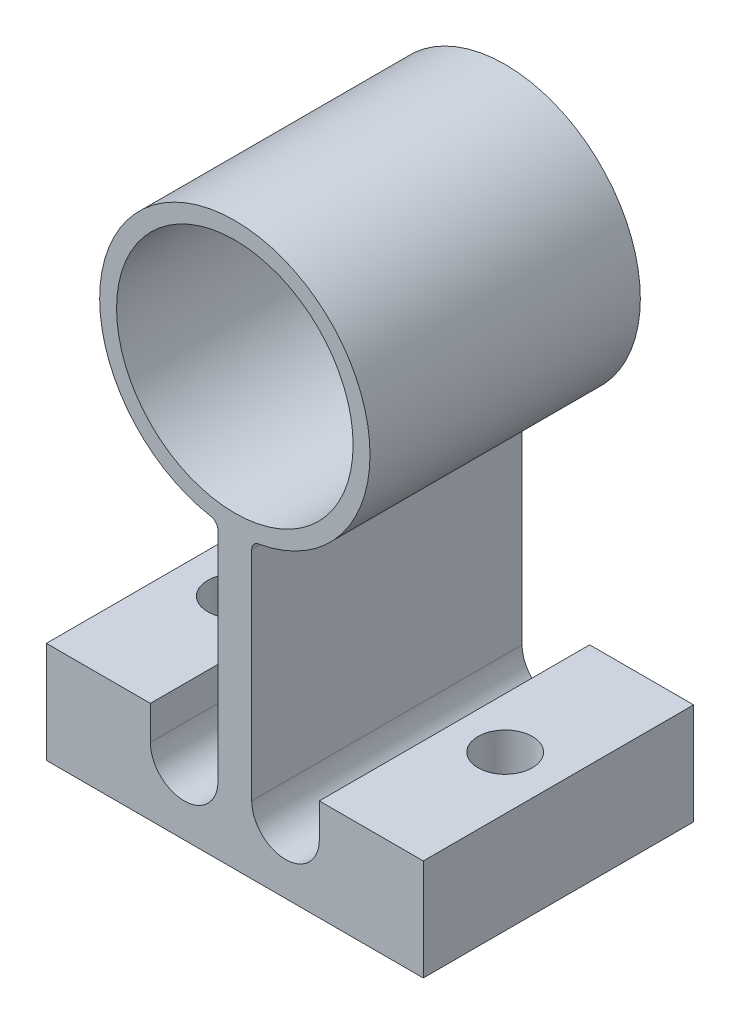
ISO-10303-21;
HEADER;
FILE_DESCRIPTION(('STEP AP214'),'2;1');
FILE_NAME('part.step','',(''),(''),'','','');
FILE_SCHEMA(('AUTOMOTIVE_DESIGN { 1 0 10303 214 1 1 1 1 }'));
ENDSEC;
DATA;
#1=APPLICATION_CONTEXT('core data for automotive mechanical design processes');
#2=APPLICATION_PROTOCOL_DEFINITION('international standard','automotive_design',2000,#1);
#3=PRODUCT_CONTEXT('',#1,'mechanical');
#4=PRODUCT('Part','Part','',(#3));
#5=PRODUCT_RELATED_PRODUCT_CATEGORY('part','',(#4));
#6=PRODUCT_DEFINITION_FORMATION('','',#4);
#7=PRODUCT_DEFINITION_CONTEXT('part definition',#1,'design');
#8=PRODUCT_DEFINITION('design','',#6,#7);
#9=PRODUCT_DEFINITION_SHAPE('','',#8);
#10=(LENGTH_UNIT() NAMED_UNIT(*) SI_UNIT(.MILLI.,.METRE.));
#11=(NAMED_UNIT(*) PLANE_ANGLE_UNIT() SI_UNIT($,.RADIAN.));
#12=(NAMED_UNIT(*) SI_UNIT($,.STERADIAN.) SOLID_ANGLE_UNIT());
#13=UNCERTAINTY_MEASURE_WITH_UNIT(LENGTH_MEASURE(1.E-05),#10,'distance_accuracy_value','');
#14=(GEOMETRIC_REPRESENTATION_CONTEXT(3) GLOBAL_UNCERTAINTY_ASSIGNED_CONTEXT((#13)) GLOBAL_UNIT_ASSIGNED_CONTEXT((#10,
#11,#12)) REPRESENTATION_CONTEXT('',''));
#15=CARTESIAN_POINT('',(0.,0.,0.));
#16=DIRECTION('',(0.,0.,1.));
#17=DIRECTION('',(1.,0.,0.));
#18=AXIS2_PLACEMENT_3D('',#15,#16,#17);
#19=CARTESIAN_POINT('',(0.,0.,-12.7));
#20=DIRECTION('',(0.,0.,-1.));
#21=DIRECTION('',(-1.,0.,0.));
#22=AXIS2_PLACEMENT_3D('',#19,#20,#21);
#23=PLANE('',#22);
#24=DIRECTION('',(0.,-1.,0.));
#25=VECTOR('',#24,1.);
#26=CARTESIAN_POINT('',(1.5875,-12.6003906189451,-12.7));
#27=LINE('',#26,#25);
#28=CARTESIAN_POINT('',(1.5875,-13.2819779212284,-12.7));
#29=VERTEX_POINT('',#28);
#30=CARTESIAN_POINT('',(1.58749999999999,-33.7337,-12.7));
#31=VERTEX_POINT('',#30);
#32=EDGE_CURVE('E301',#29,#31,#27,.T.);
#33=ORIENTED_EDGE('',*,*,#32,.T.);
#34=CARTESIAN_POINT('',(4.76249999999999,-33.7337,-12.7));
#35=DIRECTION('',(0.,0.,-1.));
#36=DIRECTION('',(1.,0.,0.));
#37=AXIS2_PLACEMENT_3D('',#34,#35,#36);
#38=CIRCLE('',#37,3.175);
#39=CARTESIAN_POINT('',(7.93749999999999,-33.7337,-12.7));
#40=VERTEX_POINT('',#39);
#41=EDGE_CURVE('E155',#40,#31,#38,.T.);
#42=ORIENTED_EDGE('',*,*,#41,.F.);
#43=DIRECTION('',(0.,-1.,0.));
#44=VECTOR('',#43,1.);
#45=CARTESIAN_POINT('',(7.93749999999999,-33.7337,-12.7));
#46=LINE('',#45,#44);
#47=CARTESIAN_POINT('',(7.9375,-30.5587,-12.7));
#48=VERTEX_POINT('',#47);
#49=EDGE_CURVE('E338',#48,#40,#46,.T.);
#50=ORIENTED_EDGE('',*,*,#49,.F.);
#51=DIRECTION('',(1.,0.,0.));
#52=VECTOR('',#51,1.);
#53=CARTESIAN_POINT('',(17.705953405,-30.5587,-12.7));
#54=LINE('',#53,#52);
#55=CARTESIAN_POINT('',(17.705953405,-30.5587,-12.7));
#56=VERTEX_POINT('',#55);
#57=EDGE_CURVE('E163',#48,#56,#54,.T.);
#58=ORIENTED_EDGE('',*,*,#57,.T.);
#59=DIRECTION('',(0.,-1.,0.));
#60=VECTOR('',#59,1.);
#61=CARTESIAN_POINT('',(17.705953405,-40.0837,-12.7));
#62=LINE('',#61,#60);
#63=CARTESIAN_POINT('',(17.705953405,-40.0837,-12.7));
#64=VERTEX_POINT('',#63);
#65=EDGE_CURVE('E306',#56,#64,#62,.T.);
#66=ORIENTED_EDGE('',*,*,#65,.T.);
#67=DIRECTION('',(-1.,0.,0.));
#68=VECTOR('',#67,1.);
#69=CARTESIAN_POINT('',(-17.705953405,-40.0837,-12.7));
#70=LINE('',#69,#68);
#71=CARTESIAN_POINT('',(-17.705953405,-40.0837,-12.7));
#72=VERTEX_POINT('',#71);
#73=EDGE_CURVE('E309',#64,#72,#70,.T.);
#74=ORIENTED_EDGE('',*,*,#73,.T.);
#75=DIRECTION('',(0.,1.,0.));
#76=VECTOR('',#75,1.);
#77=CARTESIAN_POINT('',(-17.705953405,-40.0837,-12.7));
#78=LINE('',#77,#76);
#79=CARTESIAN_POINT('',(-17.705953405,-30.5587,-12.7));
#80=VERTEX_POINT('',#79);
#81=EDGE_CURVE('E194',#72,#80,#78,.T.);
#82=ORIENTED_EDGE('',*,*,#81,.T.);
#83=DIRECTION('',(1.,0.,0.));
#84=VECTOR('',#83,1.);
#85=CARTESIAN_POINT('',(-17.705953405,-30.5587,-12.7));
#86=LINE('',#85,#84);
#87=CARTESIAN_POINT('',(-7.93750000000001,-30.5587,-12.7));
#88=VERTEX_POINT('',#87);
#89=EDGE_CURVE('E188',#80,#88,#86,.T.);
#90=ORIENTED_EDGE('',*,*,#89,.T.);
#91=DIRECTION('',(0.,1.,0.));
#92=VECTOR('',#91,1.);
#93=CARTESIAN_POINT('',(-7.9375,-33.7337,-12.7));
#94=LINE('',#93,#92);
#95=CARTESIAN_POINT('',(-7.9375,-33.7337,-12.7));
#96=VERTEX_POINT('',#95);
#97=EDGE_CURVE('E252',#96,#88,#94,.T.);
#98=ORIENTED_EDGE('',*,*,#97,.F.);
#99=CARTESIAN_POINT('',(-4.7625,-33.7337,-12.7));
#100=DIRECTION('',(0.,0.,-1.));
#101=DIRECTION('',(-1.,0.,0.));
#102=AXIS2_PLACEMENT_3D('',#99,#100,#101);
#103=CIRCLE('',#102,3.175);
#104=CARTESIAN_POINT('',(-1.5875,-33.7337,-12.7));
#105=VERTEX_POINT('',#104);
#106=EDGE_CURVE('E243',#105,#96,#103,.T.);
#107=ORIENTED_EDGE('',*,*,#106,.F.);
#108=DIRECTION('',(0.,1.,0.));
#109=VECTOR('',#108,1.);
#110=CARTESIAN_POINT('',(-1.5875,-12.6003906189451,-12.7));
#111=LINE('',#110,#109);
#112=CARTESIAN_POINT('',(-1.5875,-13.2819779212284,-12.7));
#113=VERTEX_POINT('',#112);
#114=EDGE_CURVE('E57',#105,#113,#111,.T.);
#115=ORIENTED_EDGE('',*,*,#114,.T.);
#116=CARTESIAN_POINT('',(-2.38125,-13.2819779212284,-12.7));
#117=DIRECTION('',(0.,0.,-1.));
#118=DIRECTION('',(-1.,0.,0.));
#119=AXIS2_PLACEMENT_3D('',#116,#117,#118);
#120=CIRCLE('',#119,0.79375);
#121=CARTESIAN_POINT('',(-2.24117647058823,-12.5006851023327,-12.7));
#122=VERTEX_POINT('',#121);
#123=EDGE_CURVE('E11',#113,#122,#120,.F.);
#124=ORIENTED_EDGE('',*,*,#123,.T.);
#125=CARTESIAN_POINT('',(0.,0.,-12.7));
#126=DIRECTION('',(0.,0.,-1.));
#127=DIRECTION('',(-1.,0.,0.));
#128=AXIS2_PLACEMENT_3D('',#125,#126,#127);
#129=CIRCLE('',#128,12.7);
#130=CARTESIAN_POINT('',(2.24117647058823,-12.5006851023327,-12.7));
#131=VERTEX_POINT('',#130);
#132=EDGE_CURVE('E238',#122,#131,#129,.T.);
#133=ORIENTED_EDGE('',*,*,#132,.T.);
#134=CARTESIAN_POINT('',(2.38125,-13.2819779212284,-12.7));
#135=DIRECTION('',(0.,0.,-1.));
#136=DIRECTION('',(-1.,0.,0.));
#137=AXIS2_PLACEMENT_3D('',#134,#135,#136);
#138=CIRCLE('',#137,0.79375);
#139=EDGE_CURVE('E222',#131,#29,#138,.F.);
#140=ORIENTED_EDGE('',*,*,#139,.T.);
#141=EDGE_LOOP('',(#33,#42,#50,#58,#66,#74,#82,#90,#98,#107,#115,#124,#133,#140));
#142=FACE_BOUND('',#141,.T.);
#143=CARTESIAN_POINT('',(0.,0.,-12.7));
#144=DIRECTION('',(0.,0.,-1.));
#145=DIRECTION('',(-1.,0.,0.));
#146=AXIS2_PLACEMENT_3D('',#143,#144,#145);
#147=CIRCLE('',#146,11.1125);
#148=CARTESIAN_POINT('',(-11.1125,0.,-12.7));
#149=VERTEX_POINT('',#148);
#150=EDGE_CURVE('E288',#149,#149,#147,.T.);
#151=ORIENTED_EDGE('',*,*,#150,.F.);
#152=EDGE_LOOP('',(#151));
#153=FACE_BOUND('',#152,.T.);
#154=ADVANCED_FACE('F42',(#142,#153),#23,.T.);
#155=CARTESIAN_POINT('',(0.,0.,12.7));
#156=DIRECTION('',(0.,0.,-1.));
#157=DIRECTION('',(-1.,0.,0.));
#158=AXIS2_PLACEMENT_3D('',#155,#156,#157);
#159=PLANE('',#158);
#160=CARTESIAN_POINT('',(4.76249999999999,-33.7337,12.7));
#161=DIRECTION('',(0.,0.,-1.));
#162=DIRECTION('',(1.,0.,0.));
#163=AXIS2_PLACEMENT_3D('',#160,#161,#162);
#164=CIRCLE('',#163,3.175);
#165=CARTESIAN_POINT('',(7.93749999999999,-33.7337,12.7));
#166=VERTEX_POINT('',#165);
#167=CARTESIAN_POINT('',(1.58749999999999,-33.7337,12.7));
#168=VERTEX_POINT('',#167);
#169=EDGE_CURVE('E154',#166,#168,#164,.T.);
#170=ORIENTED_EDGE('',*,*,#169,.T.);
#171=DIRECTION('',(0.,-1.,0.));
#172=VECTOR('',#171,1.);
#173=CARTESIAN_POINT('',(1.5875,-12.6003906189451,12.7));
#174=LINE('',#173,#172);
#175=CARTESIAN_POINT('',(1.5875,-13.2819779212284,12.7));
#176=VERTEX_POINT('',#175);
#177=EDGE_CURVE('E172',#176,#168,#174,.T.);
#178=ORIENTED_EDGE('',*,*,#177,.F.);
#179=CARTESIAN_POINT('',(2.38125,-13.2819779212284,12.7));
#180=DIRECTION('',(0.,0.,-1.));
#181=DIRECTION('',(-1.,0.,0.));
#182=AXIS2_PLACEMENT_3D('',#179,#180,#181);
#183=CIRCLE('',#182,0.79375);
#184=CARTESIAN_POINT('',(2.24117647058823,-12.5006851023327,12.7));
#185=VERTEX_POINT('',#184);
#186=EDGE_CURVE('E219',#176,#185,#183,.T.);
#187=ORIENTED_EDGE('',*,*,#186,.T.);
#188=CARTESIAN_POINT('',(0.,0.,12.7));
#189=DIRECTION('',(0.,0.,-1.));
#190=DIRECTION('',(-1.,0.,0.));
#191=AXIS2_PLACEMENT_3D('',#188,#189,#190);
#192=CIRCLE('',#191,12.7);
#193=CARTESIAN_POINT('',(-2.24117647058823,-12.5006851023327,12.7));
#194=VERTEX_POINT('',#193);
#195=EDGE_CURVE('E179',#194,#185,#192,.T.);
#196=ORIENTED_EDGE('',*,*,#195,.F.);
#197=CARTESIAN_POINT('',(-2.38125,-13.2819779212284,12.7));
#198=DIRECTION('',(0.,0.,-1.));
#199=DIRECTION('',(-1.,0.,0.));
#200=AXIS2_PLACEMENT_3D('',#197,#198,#199);
#201=CIRCLE('',#200,0.79375);
#202=CARTESIAN_POINT('',(-1.5875,-13.2819779212284,12.7));
#203=VERTEX_POINT('',#202);
#204=EDGE_CURVE('E51',#194,#203,#201,.T.);
#205=ORIENTED_EDGE('',*,*,#204,.T.);
#206=DIRECTION('',(0.,1.,0.));
#207=VECTOR('',#206,1.);
#208=CARTESIAN_POINT('',(-1.5875,-12.6003906189451,12.7));
#209=LINE('',#208,#207);
#210=CARTESIAN_POINT('',(-1.5875,-33.7337,12.7));
#211=VERTEX_POINT('',#210);
#212=EDGE_CURVE('E64',#211,#203,#209,.T.);
#213=ORIENTED_EDGE('',*,*,#212,.F.);
#214=CARTESIAN_POINT('',(-4.7625,-33.7337,12.7));
#215=DIRECTION('',(0.,0.,-1.));
#216=DIRECTION('',(-1.,0.,0.));
#217=AXIS2_PLACEMENT_3D('',#214,#215,#216);
#218=CIRCLE('',#217,3.175);
#219=CARTESIAN_POINT('',(-7.9375,-33.7337,12.7));
#220=VERTEX_POINT('',#219);
#221=EDGE_CURVE('E245',#211,#220,#218,.T.);
#222=ORIENTED_EDGE('',*,*,#221,.T.);
#223=DIRECTION('',(0.,1.,0.));
#224=VECTOR('',#223,1.);
#225=CARTESIAN_POINT('',(-7.9375,-33.7337,12.7));
#226=LINE('',#225,#224);
#227=CARTESIAN_POINT('',(-7.93750000000001,-30.5587,12.7));
#228=VERTEX_POINT('',#227);
#229=EDGE_CURVE('E248',#220,#228,#226,.T.);
#230=ORIENTED_EDGE('',*,*,#229,.T.);
#231=DIRECTION('',(1.,0.,0.));
#232=VECTOR('',#231,1.);
#233=CARTESIAN_POINT('',(-17.705953405,-30.5587,12.7));
#234=LINE('',#233,#232);
#235=CARTESIAN_POINT('',(-17.705953405,-30.5587,12.7));
#236=VERTEX_POINT('',#235);
#237=EDGE_CURVE('E292',#236,#228,#234,.T.);
#238=ORIENTED_EDGE('',*,*,#237,.F.);
#239=DIRECTION('',(0.,1.,0.));
#240=VECTOR('',#239,1.);
#241=CARTESIAN_POINT('',(-17.705953405,-40.0837,12.7));
#242=LINE('',#241,#240);
#243=CARTESIAN_POINT('',(-17.705953405,-40.0837,12.7));
#244=VERTEX_POINT('',#243);
#245=EDGE_CURVE('E185',#244,#236,#242,.T.);
#246=ORIENTED_EDGE('',*,*,#245,.F.);
#247=DIRECTION('',(-1.,0.,0.));
#248=VECTOR('',#247,1.);
#249=CARTESIAN_POINT('',(-17.705953405,-40.0837,12.7));
#250=LINE('',#249,#248);
#251=CARTESIAN_POINT('',(17.705953405,-40.0837,12.7));
#252=VERTEX_POINT('',#251);
#253=EDGE_CURVE('E177',#252,#244,#250,.T.);
#254=ORIENTED_EDGE('',*,*,#253,.F.);
#255=DIRECTION('',(0.,-1.,0.));
#256=VECTOR('',#255,1.);
#257=CARTESIAN_POINT('',(17.705953405,-40.0837,12.7));
#258=LINE('',#257,#256);
#259=CARTESIAN_POINT('',(17.705953405,-30.5587,12.7));
#260=VERTEX_POINT('',#259);
#261=EDGE_CURVE('E170',#260,#252,#258,.T.);
#262=ORIENTED_EDGE('',*,*,#261,.F.);
#263=DIRECTION('',(1.,0.,0.));
#264=VECTOR('',#263,1.);
#265=CARTESIAN_POINT('',(17.705953405,-30.5587,12.7));
#266=LINE('',#265,#264);
#267=CARTESIAN_POINT('',(7.9375,-30.5587,12.7));
#268=VERTEX_POINT('',#267);
#269=EDGE_CURVE('E161',#268,#260,#266,.T.);
#270=ORIENTED_EDGE('',*,*,#269,.F.);
#271=DIRECTION('',(0.,-1.,0.));
#272=VECTOR('',#271,1.);
#273=CARTESIAN_POINT('',(7.93749999999999,-33.7337,12.7));
#274=LINE('',#273,#272);
#275=EDGE_CURVE('E142',#268,#166,#274,.T.);
#276=ORIENTED_EDGE('',*,*,#275,.T.);
#277=EDGE_LOOP('',(#170,#178,#187,#196,#205,#213,#222,#230,#238,#246,#254,#262,#270,#276));
#278=FACE_BOUND('',#277,.T.);
#279=CARTESIAN_POINT('',(0.,0.,12.7));
#280=DIRECTION('',(0.,0.,-1.));
#281=DIRECTION('',(-1.,0.,0.));
#282=AXIS2_PLACEMENT_3D('',#279,#280,#281);
#283=CIRCLE('',#282,11.1125);
#284=CARTESIAN_POINT('',(-11.1125,0.,12.7));
#285=VERTEX_POINT('',#284);
#286=EDGE_CURVE('E287',#285,#285,#283,.T.);
#287=ORIENTED_EDGE('',*,*,#286,.T.);
#288=EDGE_LOOP('',(#287));
#289=FACE_BOUND('',#288,.T.);
#290=ADVANCED_FACE('F167',(#278,#289),#159,.F.);
#291=CARTESIAN_POINT('',(-17.705953405,-30.5587,-12.7));
#292=DIRECTION('',(0.,-1.,0.));
#293=DIRECTION('',(1.,0.,0.));
#294=AXIS2_PLACEMENT_3D('',#291,#292,#293);
#295=PLANE('',#294);
#296=CARTESIAN_POINT('',(-12.7,-30.5587,0.));
#297=DIRECTION('',(0.,-1.,0.));
#298=DIRECTION('',(1.,0.,0.));
#299=AXIS2_PLACEMENT_3D('',#296,#297,#298);
#300=CIRCLE('',#299,2.55269999999999);
#301=CARTESIAN_POINT('',(-10.1473,-30.5587,0.));
#302=VERTEX_POINT('',#301);
#303=EDGE_CURVE('E275',#302,#302,#300,.T.);
#304=ORIENTED_EDGE('',*,*,#303,.T.);
#305=EDGE_LOOP('',(#304));
#306=FACE_BOUND('',#305,.T.);
#307=ORIENTED_EDGE('',*,*,#237,.T.);
#308=DIRECTION('',(0.,0.,-1.));
#309=VECTOR('',#308,1.);
#310=CARTESIAN_POINT('',(-7.93750000000001,-30.5587,12.7));
#311=LINE('',#310,#309);
#312=EDGE_CURVE('E265',#228,#88,#311,.T.);
#313=ORIENTED_EDGE('',*,*,#312,.T.);
#314=ORIENTED_EDGE('',*,*,#89,.F.);
#315=DIRECTION('',(0.,0.,1.));
#316=VECTOR('',#315,1.);
#317=CARTESIAN_POINT('',(-17.705953405,-30.5587,-12.7));
#318=LINE('',#317,#316);
#319=EDGE_CURVE('E189',#80,#236,#318,.T.);
#320=ORIENTED_EDGE('',*,*,#319,.T.);
#321=EDGE_LOOP('',(#307,#313,#314,#320));
#322=FACE_BOUND('',#321,.T.);
#323=ADVANCED_FACE('F356',(#306,#322),#295,.F.);
#324=CARTESIAN_POINT('',(-1.5875,-12.6003906189451,-12.7));
#325=DIRECTION('',(1.,0.,0.));
#326=DIRECTION('',(0.,1.,0.));
#327=AXIS2_PLACEMENT_3D('',#324,#325,#326);
#328=PLANE('',#327);
#329=ORIENTED_EDGE('',*,*,#114,.F.);
#330=DIRECTION('',(0.,0.,-1.));
#331=VECTOR('',#330,1.);
#332=CARTESIAN_POINT('',(-1.5875,-33.7337,12.7));
#333=LINE('',#332,#331);
#334=EDGE_CURVE('E235',#211,#105,#333,.T.);
#335=ORIENTED_EDGE('',*,*,#334,.F.);
#336=ORIENTED_EDGE('',*,*,#212,.T.);
#337=DIRECTION('',(0.,0.,-1.));
#338=VECTOR('',#337,1.);
#339=CARTESIAN_POINT('',(-1.5875,-13.2819779212284,-12.7));
#340=LINE('',#339,#338);
#341=EDGE_CURVE('E216',#203,#113,#340,.T.);
#342=ORIENTED_EDGE('',*,*,#341,.T.);
#343=EDGE_LOOP('',(#329,#335,#336,#342));
#344=FACE_BOUND('',#343,.T.);
#345=ADVANCED_FACE('F233',(#344),#328,.F.);
#346=CARTESIAN_POINT('',(0.,0.,-12.7));
#347=DIRECTION('',(0.,0.,1.));
#348=DIRECTION('',(1.,0.,0.));
#349=AXIS2_PLACEMENT_3D('',#346,#347,#348);
#350=CYLINDRICAL_SURFACE('',#349,12.7);
#351=ORIENTED_EDGE('',*,*,#195,.T.);
#352=DIRECTION('',(0.,0.,1.));
#353=VECTOR('',#352,1.);
#354=CARTESIAN_POINT('',(2.24117647058824,-12.5006851023327,-12.7));
#355=LINE('',#354,#353);
#356=EDGE_CURVE('E213',#185,#131,#355,.F.);
#357=ORIENTED_EDGE('',*,*,#356,.T.);
#358=ORIENTED_EDGE('',*,*,#132,.F.);
#359=DIRECTION('',(0.,0.,1.));
#360=VECTOR('',#359,1.);
#361=CARTESIAN_POINT('',(-2.24117647058824,-12.5006851023327,-12.7));
#362=LINE('',#361,#360);
#363=EDGE_CURVE('E209',#122,#194,#362,.T.);
#364=ORIENTED_EDGE('',*,*,#363,.T.);
#365=EDGE_LOOP('',(#351,#357,#358,#364));
#366=FACE_BOUND('',#365,.T.);
#367=ADVANCED_FACE('F322',(#366),#350,.T.);
#368=CARTESIAN_POINT('',(1.5875,-12.6003906189451,-12.7));
#369=DIRECTION('',(-1.,0.,0.));
#370=DIRECTION('',(0.,-1.,0.));
#371=AXIS2_PLACEMENT_3D('',#368,#369,#370);
#372=PLANE('',#371);
#373=ORIENTED_EDGE('',*,*,#177,.T.);
#374=DIRECTION('',(0.,0.,-1.));
#375=VECTOR('',#374,1.);
#376=CARTESIAN_POINT('',(1.58749999999999,-33.7337,12.7));
#377=LINE('',#376,#375);
#378=EDGE_CURVE('E254',#168,#31,#377,.T.);
#379=ORIENTED_EDGE('',*,*,#378,.T.);
#380=ORIENTED_EDGE('',*,*,#32,.F.);
#381=DIRECTION('',(0.,0.,-1.));
#382=VECTOR('',#381,1.);
#383=CARTESIAN_POINT('',(1.5875,-13.2819779212284,12.7));
#384=LINE('',#383,#382);
#385=EDGE_CURVE('E205',#29,#176,#384,.F.);
#386=ORIENTED_EDGE('',*,*,#385,.T.);
#387=EDGE_LOOP('',(#373,#379,#380,#386));
#388=FACE_BOUND('',#387,.T.);
#389=ADVANCED_FACE('F331',(#388),#372,.F.);
#390=CARTESIAN_POINT('',(17.705953405,-30.5587,-12.7));
#391=DIRECTION('',(0.,-1.,0.));
#392=DIRECTION('',(1.,0.,0.));
#393=AXIS2_PLACEMENT_3D('',#390,#391,#392);
#394=PLANE('',#393);
#395=CARTESIAN_POINT('',(12.7,-30.5587,0.));
#396=DIRECTION('',(0.,-1.,0.));
#397=DIRECTION('',(1.,0.,0.));
#398=AXIS2_PLACEMENT_3D('',#395,#396,#397);
#399=CIRCLE('',#398,2.55269999999999);
#400=CARTESIAN_POINT('',(15.2527,-30.5587,0.));
#401=VERTEX_POINT('',#400);
#402=EDGE_CURVE('E283',#401,#401,#399,.T.);
#403=ORIENTED_EDGE('',*,*,#402,.T.);
#404=EDGE_LOOP('',(#403));
#405=FACE_BOUND('',#404,.T.);
#406=ORIENTED_EDGE('',*,*,#57,.F.);
#407=DIRECTION('',(0.,0.,-1.));
#408=VECTOR('',#407,1.);
#409=CARTESIAN_POINT('',(7.9375,-30.5587,12.7));
#410=LINE('',#409,#408);
#411=EDGE_CURVE('E146',#268,#48,#410,.T.);
#412=ORIENTED_EDGE('',*,*,#411,.F.);
#413=ORIENTED_EDGE('',*,*,#269,.T.);
#414=DIRECTION('',(0.,0.,1.));
#415=VECTOR('',#414,1.);
#416=CARTESIAN_POINT('',(17.705953405,-30.5587,-12.7));
#417=LINE('',#416,#415);
#418=EDGE_CURVE('E202',#56,#260,#417,.T.);
#419=ORIENTED_EDGE('',*,*,#418,.F.);
#420=EDGE_LOOP('',(#406,#412,#413,#419));
#421=FACE_BOUND('',#420,.T.);
#422=ADVANCED_FACE('F159',(#405,#421),#394,.F.);
#423=CARTESIAN_POINT('',(17.705953405,-40.0837,-12.7));
#424=DIRECTION('',(-1.,0.,0.));
#425=DIRECTION('',(0.,0.,1.));
#426=AXIS2_PLACEMENT_3D('',#423,#424,#425);
#427=PLANE('',#426);
#428=ORIENTED_EDGE('',*,*,#261,.T.);
#429=DIRECTION('',(0.,0.,1.));
#430=VECTOR('',#429,1.);
#431=CARTESIAN_POINT('',(17.705953405,-40.0837,-12.7));
#432=LINE('',#431,#430);
#433=EDGE_CURVE('E198',#64,#252,#432,.T.);
#434=ORIENTED_EDGE('',*,*,#433,.F.);
#435=ORIENTED_EDGE('',*,*,#65,.F.);
#436=ORIENTED_EDGE('',*,*,#418,.T.);
#437=EDGE_LOOP('',(#428,#434,#435,#436));
#438=FACE_BOUND('',#437,.T.);
#439=ADVANCED_FACE('F369',(#438),#427,.F.);
#440=CARTESIAN_POINT('',(-17.705953405,-40.0837,-12.7));
#441=DIRECTION('',(0.,1.,0.));
#442=DIRECTION('',(0.,0.,1.));
#443=AXIS2_PLACEMENT_3D('',#440,#441,#442);
#444=PLANE('',#443);
#445=CARTESIAN_POINT('',(-12.7,-40.0837,0.));
#446=DIRECTION('',(0.,-1.,0.));
#447=DIRECTION('',(0.,0.,-1.));
#448=AXIS2_PLACEMENT_3D('',#445,#446,#447);
#449=CIRCLE('',#448,2.55269999999999);
#450=CARTESIAN_POINT('',(-12.7,-40.0837,-2.55269999999999));
#451=VERTEX_POINT('',#450);
#452=EDGE_CURVE('E269',#451,#451,#449,.T.);
#453=ORIENTED_EDGE('',*,*,#452,.F.);
#454=EDGE_LOOP('',(#453));
#455=FACE_BOUND('',#454,.T.);
#456=CARTESIAN_POINT('',(12.7,-40.0837,0.));
#457=DIRECTION('',(0.,-1.,0.));
#458=DIRECTION('',(0.,0.,-1.));
#459=AXIS2_PLACEMENT_3D('',#456,#457,#458);
#460=CIRCLE('',#459,2.55269999999999);
#461=CARTESIAN_POINT('',(12.7,-40.0837,-2.55269999999999));
#462=VERTEX_POINT('',#461);
#463=EDGE_CURVE('E279',#462,#462,#460,.T.);
#464=ORIENTED_EDGE('',*,*,#463,.F.);
#465=EDGE_LOOP('',(#464));
#466=FACE_BOUND('',#465,.T.);
#467=ORIENTED_EDGE('',*,*,#253,.T.);
#468=DIRECTION('',(0.,0.,1.));
#469=VECTOR('',#468,1.);
#470=CARTESIAN_POINT('',(-17.705953405,-40.0837,-12.7));
#471=LINE('',#470,#469);
#472=EDGE_CURVE('E193',#72,#244,#471,.T.);
#473=ORIENTED_EDGE('',*,*,#472,.F.);
#474=ORIENTED_EDGE('',*,*,#73,.F.);
#475=ORIENTED_EDGE('',*,*,#433,.T.);
#476=EDGE_LOOP('',(#467,#473,#474,#475));
#477=FACE_BOUND('',#476,.T.);
#478=ADVANCED_FACE('F364',(#455,#466,#477),#444,.F.);
#479=CARTESIAN_POINT('',(-17.705953405,-40.0837,-12.7));
#480=DIRECTION('',(1.,0.,0.));
#481=DIRECTION('',(0.,0.,-1.));
#482=AXIS2_PLACEMENT_3D('',#479,#480,#481);
#483=PLANE('',#482);
#484=ORIENTED_EDGE('',*,*,#245,.T.);
#485=ORIENTED_EDGE('',*,*,#319,.F.);
#486=ORIENTED_EDGE('',*,*,#81,.F.);
#487=ORIENTED_EDGE('',*,*,#472,.T.);
#488=EDGE_LOOP('',(#484,#485,#486,#487));
#489=FACE_BOUND('',#488,.T.);
#490=ADVANCED_FACE('F361',(#489),#483,.F.);
#491=CARTESIAN_POINT('',(0.,0.,-12.7));
#492=DIRECTION('',(0.,0.,1.));
#493=DIRECTION('',(1.,0.,0.));
#494=AXIS2_PLACEMENT_3D('',#491,#492,#493);
#495=CYLINDRICAL_SURFACE('',#494,11.1125);
#496=ORIENTED_EDGE('',*,*,#150,.T.);
#497=EDGE_LOOP('',(#496));
#498=FACE_BOUND('',#497,.T.);
#499=ORIENTED_EDGE('',*,*,#286,.F.);
#500=EDGE_LOOP('',(#499));
#501=FACE_BOUND('',#500,.T.);
#502=ADVANCED_FACE('F387',(#498,#501),#495,.F.);
#503=CARTESIAN_POINT('',(2.38125,-13.2819779212284,-12.7));
#504=DIRECTION('',(0.,0.,1.));
#505=DIRECTION('',(1.,0.,0.));
#506=AXIS2_PLACEMENT_3D('',#503,#504,#505);
#507=CYLINDRICAL_SURFACE('',#506,0.79375);
#508=ORIENTED_EDGE('',*,*,#139,.F.);
#509=ORIENTED_EDGE('',*,*,#356,.F.);
#510=ORIENTED_EDGE('',*,*,#186,.F.);
#511=ORIENTED_EDGE('',*,*,#385,.F.);
#512=EDGE_LOOP('',(#508,#509,#510,#511));
#513=FACE_BOUND('',#512,.T.);
#514=ADVANCED_FACE('F326',(#513),#507,.F.);
#515=CARTESIAN_POINT('',(-2.38125,-13.2819779212284,-12.7));
#516=DIRECTION('',(0.,0.,1.));
#517=DIRECTION('',(1.,0.,0.));
#518=AXIS2_PLACEMENT_3D('',#515,#516,#517);
#519=CYLINDRICAL_SURFACE('',#518,0.79375);
#520=ORIENTED_EDGE('',*,*,#123,.F.);
#521=ORIENTED_EDGE('',*,*,#341,.F.);
#522=ORIENTED_EDGE('',*,*,#204,.F.);
#523=ORIENTED_EDGE('',*,*,#363,.F.);
#524=EDGE_LOOP('',(#520,#521,#522,#523));
#525=FACE_BOUND('',#524,.T.);
#526=ADVANCED_FACE('F44',(#525),#519,.F.);
#527=CARTESIAN_POINT('',(12.7,-40.0837,0.));
#528=DIRECTION('',(0.,-1.,0.));
#529=DIRECTION('',(0.,0.,-1.));
#530=AXIS2_PLACEMENT_3D('',#527,#528,#529);
#531=CYLINDRICAL_SURFACE('',#530,2.55269999999999);
#532=ORIENTED_EDGE('',*,*,#463,.T.);
#533=EDGE_LOOP('',(#532));
#534=FACE_BOUND('',#533,.T.);
#535=ORIENTED_EDGE('',*,*,#402,.F.);
#536=EDGE_LOOP('',(#535));
#537=FACE_BOUND('',#536,.T.);
#538=ADVANCED_FACE('F404',(#534,#537),#531,.F.);
#539=CARTESIAN_POINT('',(-12.7,-40.0837,0.));
#540=DIRECTION('',(0.,-1.,0.));
#541=DIRECTION('',(0.,0.,-1.));
#542=AXIS2_PLACEMENT_3D('',#539,#540,#541);
#543=CYLINDRICAL_SURFACE('',#542,2.55269999999999);
#544=ORIENTED_EDGE('',*,*,#452,.T.);
#545=EDGE_LOOP('',(#544));
#546=FACE_BOUND('',#545,.T.);
#547=ORIENTED_EDGE('',*,*,#303,.F.);
#548=EDGE_LOOP('',(#547));
#549=FACE_BOUND('',#548,.T.);
#550=ADVANCED_FACE('F462',(#546,#549),#543,.F.);
#551=CARTESIAN_POINT('',(-7.9375,-33.7337,12.7));
#552=DIRECTION('',(-1.,0.,0.));
#553=DIRECTION('',(0.,-1.,0.));
#554=AXIS2_PLACEMENT_3D('',#551,#552,#553);
#555=PLANE('',#554);
#556=ORIENTED_EDGE('',*,*,#97,.T.);
#557=ORIENTED_EDGE('',*,*,#312,.F.);
#558=ORIENTED_EDGE('',*,*,#229,.F.);
#559=DIRECTION('',(0.,0.,-1.));
#560=VECTOR('',#559,1.);
#561=CARTESIAN_POINT('',(-7.9375,-33.7337,12.7));
#562=LINE('',#561,#560);
#563=EDGE_CURVE('E247',#220,#96,#562,.T.);
#564=ORIENTED_EDGE('',*,*,#563,.T.);
#565=EDGE_LOOP('',(#556,#557,#558,#564));
#566=FACE_BOUND('',#565,.T.);
#567=ADVANCED_FACE('F470',(#566),#555,.F.);
#568=CARTESIAN_POINT('',(-4.7625,-33.7337,12.7));
#569=DIRECTION('',(0.,0.,-1.));
#570=DIRECTION('',(-1.,0.,0.));
#571=AXIS2_PLACEMENT_3D('',#568,#569,#570);
#572=CYLINDRICAL_SURFACE('',#571,3.175);
#573=ORIENTED_EDGE('',*,*,#106,.T.);
#574=ORIENTED_EDGE('',*,*,#563,.F.);
#575=ORIENTED_EDGE('',*,*,#221,.F.);
#576=ORIENTED_EDGE('',*,*,#334,.T.);
#577=EDGE_LOOP('',(#573,#574,#575,#576));
#578=FACE_BOUND('',#577,.T.);
#579=ADVANCED_FACE('F242',(#578),#572,.F.);
#580=CARTESIAN_POINT('',(4.76249999999999,-33.7337,12.7));
#581=DIRECTION('',(0.,0.,-1.));
#582=DIRECTION('',(-1.,0.,0.));
#583=AXIS2_PLACEMENT_3D('',#580,#581,#582);
#584=CYLINDRICAL_SURFACE('',#583,3.175);
#585=ORIENTED_EDGE('',*,*,#41,.T.);
#586=ORIENTED_EDGE('',*,*,#378,.F.);
#587=ORIENTED_EDGE('',*,*,#169,.F.);
#588=DIRECTION('',(0.,0.,-1.));
#589=VECTOR('',#588,1.);
#590=CARTESIAN_POINT('',(7.93749999999999,-33.7337,12.7));
#591=LINE('',#590,#589);
#592=EDGE_CURVE('E148',#166,#40,#591,.T.);
#593=ORIENTED_EDGE('',*,*,#592,.T.);
#594=EDGE_LOOP('',(#585,#586,#587,#593));
#595=FACE_BOUND('',#594,.T.);
#596=ADVANCED_FACE('F336',(#595),#584,.F.);
#597=CARTESIAN_POINT('',(7.93749999999999,-33.7337,12.7));
#598=DIRECTION('',(1.,0.,0.));
#599=DIRECTION('',(0.,1.,0.));
#600=AXIS2_PLACEMENT_3D('',#597,#598,#599);
#601=PLANE('',#600);
#602=ORIENTED_EDGE('',*,*,#49,.T.);
#603=ORIENTED_EDGE('',*,*,#592,.F.);
#604=ORIENTED_EDGE('',*,*,#275,.F.);
#605=ORIENTED_EDGE('',*,*,#411,.T.);
#606=EDGE_LOOP('',(#602,#603,#604,#605));
#607=FACE_BOUND('',#606,.T.);
#608=ADVANCED_FACE('F145',(#607),#601,.F.);
#609=CLOSED_SHELL('',(#154,#290,#323,#345,#367,#389,#422,#439,#478,#490,#502,#514,#526,#538,
#550,#567,#579,#596,#608));
#610=MANIFOLD_SOLID_BREP('B2',#609);
#611=ADVANCED_BREP_SHAPE_REPRESENTATION('',(#18,#610),#14);
#612=SHAPE_DEFINITION_REPRESENTATION(#9,#611);
ENDSEC;
END-ISO-10303-21;
